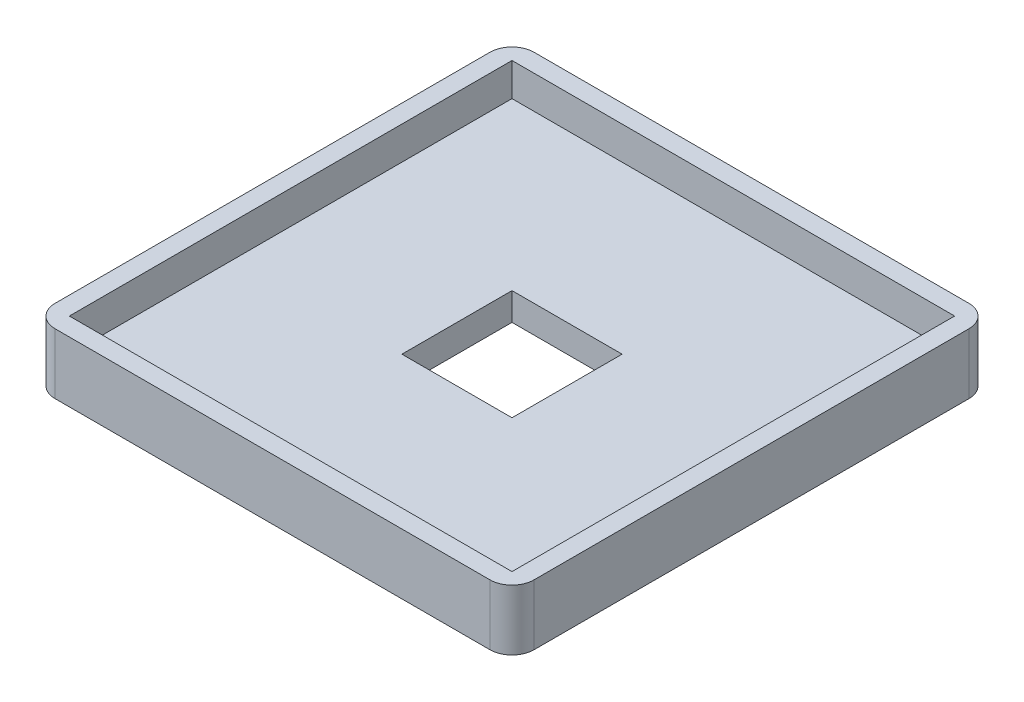
ISO-10303-21;
HEADER;
FILE_DESCRIPTION(('STEP AP214'),'2;1');
FILE_NAME('part.step','',(''),(''),'','','');
FILE_SCHEMA(('AUTOMOTIVE_DESIGN { 1 0 10303 214 1 1 1 1 }'));
ENDSEC;
DATA;
#1=APPLICATION_CONTEXT('core data for automotive mechanical design processes');
#2=APPLICATION_PROTOCOL_DEFINITION('international standard','automotive_design',2000,#1);
#3=PRODUCT_CONTEXT('',#1,'mechanical');
#4=PRODUCT('Part','Part','',(#3));
#5=PRODUCT_RELATED_PRODUCT_CATEGORY('part','',(#4));
#6=PRODUCT_DEFINITION_FORMATION('','',#4);
#7=PRODUCT_DEFINITION_CONTEXT('part definition',#1,'design');
#8=PRODUCT_DEFINITION('design','',#6,#7);
#9=PRODUCT_DEFINITION_SHAPE('','',#8);
#10=(LENGTH_UNIT() NAMED_UNIT(*) SI_UNIT(.MILLI.,.METRE.));
#11=(NAMED_UNIT(*) PLANE_ANGLE_UNIT() SI_UNIT($,.RADIAN.));
#12=(NAMED_UNIT(*) SI_UNIT($,.STERADIAN.) SOLID_ANGLE_UNIT());
#13=UNCERTAINTY_MEASURE_WITH_UNIT(LENGTH_MEASURE(1.E-05),#10,'distance_accuracy_value','');
#14=(GEOMETRIC_REPRESENTATION_CONTEXT(3) GLOBAL_UNCERTAINTY_ASSIGNED_CONTEXT((#13)) GLOBAL_UNIT_ASSIGNED_CONTEXT((#10,
#11,#12)) REPRESENTATION_CONTEXT('',''));
#15=CARTESIAN_POINT('',(0.,0.,0.));
#16=DIRECTION('',(0.,0.,1.));
#17=DIRECTION('',(1.,0.,0.));
#18=AXIS2_PLACEMENT_3D('',#15,#16,#17);
#19=CARTESIAN_POINT('',(21.75,2.5,-21.75));
#20=DIRECTION('',(-1.,0.,0.));
#21=DIRECTION('',(0.,0.,1.));
#22=AXIS2_PLACEMENT_3D('',#19,#20,#21);
#23=PLANE('',#22);
#24=DIRECTION('',(0.,0.,-1.));
#25=VECTOR('',#24,1.);
#26=CARTESIAN_POINT('',(21.75,0.,-21.75));
#27=LINE('',#26,#25);
#28=CARTESIAN_POINT('',(21.75,0.,19.75));
#29=VERTEX_POINT('',#28);
#30=CARTESIAN_POINT('',(21.75,0.,-19.75));
#31=VERTEX_POINT('',#30);
#32=EDGE_CURVE('E226',#29,#31,#27,.T.);
#33=ORIENTED_EDGE('',*,*,#32,.T.);
#34=DIRECTION('',(0.,-1.,0.));
#35=VECTOR('',#34,1.);
#36=CARTESIAN_POINT('',(21.75,2.5,-19.75));
#37=LINE('',#36,#35);
#38=CARTESIAN_POINT('',(21.75,5.5,-19.75));
#39=VERTEX_POINT('',#38);
#40=EDGE_CURVE('E262',#31,#39,#37,.F.);
#41=ORIENTED_EDGE('',*,*,#40,.T.);
#42=DIRECTION('',(0.,0.,-1.));
#43=VECTOR('',#42,1.);
#44=CARTESIAN_POINT('',(21.75,5.5,-21.75));
#45=LINE('',#44,#43);
#46=CARTESIAN_POINT('',(21.75,5.5,19.75));
#47=VERTEX_POINT('',#46);
#48=EDGE_CURVE('E216',#47,#39,#45,.T.);
#49=ORIENTED_EDGE('',*,*,#48,.F.);
#50=DIRECTION('',(0.,-1.,0.));
#51=VECTOR('',#50,1.);
#52=CARTESIAN_POINT('',(21.75,2.5,19.75));
#53=LINE('',#52,#51);
#54=EDGE_CURVE('E259',#47,#29,#53,.T.);
#55=ORIENTED_EDGE('',*,*,#54,.T.);
#56=EDGE_LOOP('',(#33,#41,#49,#55));
#57=FACE_BOUND('',#56,.T.);
#58=ADVANCED_FACE('F39',(#57),#23,.F.);
#59=CARTESIAN_POINT('',(-21.75,2.5,-21.75));
#60=DIRECTION('',(0.,0.,1.));
#61=DIRECTION('',(1.,0.,0.));
#62=AXIS2_PLACEMENT_3D('',#59,#60,#61);
#63=PLANE('',#62);
#64=DIRECTION('',(-1.,0.,0.));
#65=VECTOR('',#64,1.);
#66=CARTESIAN_POINT('',(-21.75,5.5,-21.75));
#67=LINE('',#66,#65);
#68=CARTESIAN_POINT('',(19.75,5.5,-21.75));
#69=VERTEX_POINT('',#68);
#70=CARTESIAN_POINT('',(-19.75,5.5,-21.75));
#71=VERTEX_POINT('',#70);
#72=EDGE_CURVE('E219',#69,#71,#67,.T.);
#73=ORIENTED_EDGE('',*,*,#72,.F.);
#74=DIRECTION('',(0.,-1.,0.));
#75=VECTOR('',#74,1.);
#76=CARTESIAN_POINT('',(19.75,2.5,-21.75));
#77=LINE('',#76,#75);
#78=CARTESIAN_POINT('',(19.75,0.,-21.75));
#79=VERTEX_POINT('',#78);
#80=EDGE_CURVE('E248',#69,#79,#77,.T.);
#81=ORIENTED_EDGE('',*,*,#80,.T.);
#82=DIRECTION('',(-1.,0.,0.));
#83=VECTOR('',#82,1.);
#84=CARTESIAN_POINT('',(-21.75,0.,-21.75));
#85=LINE('',#84,#83);
#86=CARTESIAN_POINT('',(-19.75,0.,-21.75));
#87=VERTEX_POINT('',#86);
#88=EDGE_CURVE('E229',#79,#87,#85,.T.);
#89=ORIENTED_EDGE('',*,*,#88,.T.);
#90=DIRECTION('',(0.,-1.,0.));
#91=VECTOR('',#90,1.);
#92=CARTESIAN_POINT('',(-19.75,2.5,-21.75));
#93=LINE('',#92,#91);
#94=EDGE_CURVE('E246',#87,#71,#93,.F.);
#95=ORIENTED_EDGE('',*,*,#94,.T.);
#96=EDGE_LOOP('',(#73,#81,#89,#95));
#97=FACE_BOUND('',#96,.T.);
#98=ADVANCED_FACE('F307',(#97),#63,.F.);
#99=CARTESIAN_POINT('',(-21.75,2.5,-21.75));
#100=DIRECTION('',(1.,0.,0.));
#101=DIRECTION('',(0.,0.,-1.));
#102=AXIS2_PLACEMENT_3D('',#99,#100,#101);
#103=PLANE('',#102);
#104=DIRECTION('',(0.,0.,1.));
#105=VECTOR('',#104,1.);
#106=CARTESIAN_POINT('',(-21.75,0.,-21.75));
#107=LINE('',#106,#105);
#108=CARTESIAN_POINT('',(-21.75,0.,-19.75));
#109=VERTEX_POINT('',#108);
#110=CARTESIAN_POINT('',(-21.75,0.,19.75));
#111=VERTEX_POINT('',#110);
#112=EDGE_CURVE('E232',#109,#111,#107,.T.);
#113=ORIENTED_EDGE('',*,*,#112,.T.);
#114=DIRECTION('',(0.,-1.,0.));
#115=VECTOR('',#114,1.);
#116=CARTESIAN_POINT('',(-21.75,2.5,19.75));
#117=LINE('',#116,#115);
#118=CARTESIAN_POINT('',(-21.75,5.5,19.75));
#119=VERTEX_POINT('',#118);
#120=EDGE_CURVE('E11',#111,#119,#117,.F.);
#121=ORIENTED_EDGE('',*,*,#120,.T.);
#122=DIRECTION('',(0.,0.,1.));
#123=VECTOR('',#122,1.);
#124=CARTESIAN_POINT('',(-21.75,5.5,-21.75));
#125=LINE('',#124,#123);
#126=CARTESIAN_POINT('',(-21.75,5.5,-19.75));
#127=VERTEX_POINT('',#126);
#128=EDGE_CURVE('E222',#127,#119,#125,.T.);
#129=ORIENTED_EDGE('',*,*,#128,.F.);
#130=DIRECTION('',(0.,-1.,0.));
#131=VECTOR('',#130,1.);
#132=CARTESIAN_POINT('',(-21.75,2.5,-19.75));
#133=LINE('',#132,#131);
#134=EDGE_CURVE('E47',#127,#109,#133,.T.);
#135=ORIENTED_EDGE('',*,*,#134,.T.);
#136=EDGE_LOOP('',(#113,#121,#129,#135));
#137=FACE_BOUND('',#136,.T.);
#138=ADVANCED_FACE('F279',(#137),#103,.F.);
#139=CARTESIAN_POINT('',(-21.75,2.5,21.75));
#140=DIRECTION('',(0.,0.,-1.));
#141=DIRECTION('',(-1.,0.,0.));
#142=AXIS2_PLACEMENT_3D('',#139,#140,#141);
#143=PLANE('',#142);
#144=DIRECTION('',(1.,0.,0.));
#145=VECTOR('',#144,1.);
#146=CARTESIAN_POINT('',(-21.75,0.,21.75));
#147=LINE('',#146,#145);
#148=CARTESIAN_POINT('',(-19.75,0.,21.75));
#149=VERTEX_POINT('',#148);
#150=CARTESIAN_POINT('',(19.75,0.,21.75));
#151=VERTEX_POINT('',#150);
#152=EDGE_CURVE('E235',#149,#151,#147,.T.);
#153=ORIENTED_EDGE('',*,*,#152,.T.);
#154=DIRECTION('',(0.,-1.,0.));
#155=VECTOR('',#154,1.);
#156=CARTESIAN_POINT('',(19.75,2.5,21.75));
#157=LINE('',#156,#155);
#158=CARTESIAN_POINT('',(19.75,5.5,21.75));
#159=VERTEX_POINT('',#158);
#160=EDGE_CURVE('E54',#151,#159,#157,.F.);
#161=ORIENTED_EDGE('',*,*,#160,.T.);
#162=DIRECTION('',(1.,0.,0.));
#163=VECTOR('',#162,1.);
#164=CARTESIAN_POINT('',(-21.75,5.5,21.75));
#165=LINE('',#164,#163);
#166=CARTESIAN_POINT('',(-19.75,5.5,21.75));
#167=VERTEX_POINT('',#166);
#168=EDGE_CURVE('E224',#167,#159,#165,.T.);
#169=ORIENTED_EDGE('',*,*,#168,.F.);
#170=DIRECTION('',(0.,-1.,0.));
#171=VECTOR('',#170,1.);
#172=CARTESIAN_POINT('',(-19.75,2.5,21.75));
#173=LINE('',#172,#171);
#174=EDGE_CURVE('E271',#167,#149,#173,.T.);
#175=ORIENTED_EDGE('',*,*,#174,.T.);
#176=EDGE_LOOP('',(#153,#161,#169,#175));
#177=FACE_BOUND('',#176,.T.);
#178=ADVANCED_FACE('F290',(#177),#143,.F.);
#179=CARTESIAN_POINT('',(0.,0.,0.));
#180=DIRECTION('',(0.,1.,0.));
#181=DIRECTION('',(0.,0.,1.));
#182=AXIS2_PLACEMENT_3D('',#179,#180,#181);
#183=PLANE('',#182);
#184=DIRECTION('',(1.,0.,0.));
#185=VECTOR('',#184,1.);
#186=CARTESIAN_POINT('',(0.,0.,5.));
#187=LINE('',#186,#185);
#188=CARTESIAN_POINT('',(-5.,0.,5.));
#189=VERTEX_POINT('',#188);
#190=CARTESIAN_POINT('',(5.,0.,5.));
#191=VERTEX_POINT('',#190);
#192=EDGE_CURVE('E241',#189,#191,#187,.T.);
#193=ORIENTED_EDGE('',*,*,#192,.T.);
#194=DIRECTION('',(0.,0.,-1.));
#195=VECTOR('',#194,1.);
#196=CARTESIAN_POINT('',(5.,0.,0.));
#197=LINE('',#196,#195);
#198=CARTESIAN_POINT('',(5.,0.,-5.));
#199=VERTEX_POINT('',#198);
#200=EDGE_CURVE('E244',#191,#199,#197,.T.);
#201=ORIENTED_EDGE('',*,*,#200,.T.);
#202=DIRECTION('',(-1.,0.,0.));
#203=VECTOR('',#202,1.);
#204=CARTESIAN_POINT('',(0.,0.,-5.));
#205=LINE('',#204,#203);
#206=CARTESIAN_POINT('',(-5.,0.,-5.));
#207=VERTEX_POINT('',#206);
#208=EDGE_CURVE('E160',#199,#207,#205,.T.);
#209=ORIENTED_EDGE('',*,*,#208,.T.);
#210=DIRECTION('',(0.,0.,1.));
#211=VECTOR('',#210,1.);
#212=CARTESIAN_POINT('',(-5.,0.,0.));
#213=LINE('',#212,#211);
#214=EDGE_CURVE('E238',#207,#189,#213,.T.);
#215=ORIENTED_EDGE('',*,*,#214,.T.);
#216=EDGE_LOOP('',(#193,#201,#209,#215));
#217=FACE_BOUND('',#216,.T.);
#218=ORIENTED_EDGE('',*,*,#88,.F.);
#219=CARTESIAN_POINT('',(19.75,0.,-19.75));
#220=DIRECTION('',(0.,1.,0.));
#221=DIRECTION('',(0.,0.,1.));
#222=AXIS2_PLACEMENT_3D('',#219,#220,#221);
#223=CIRCLE('',#222,2.);
#224=EDGE_CURVE('E257',#79,#31,#223,.F.);
#225=ORIENTED_EDGE('',*,*,#224,.T.);
#226=ORIENTED_EDGE('',*,*,#32,.F.);
#227=CARTESIAN_POINT('',(19.75,0.,19.75));
#228=DIRECTION('',(0.,1.,0.));
#229=DIRECTION('',(0.,0.,1.));
#230=AXIS2_PLACEMENT_3D('',#227,#228,#229);
#231=CIRCLE('',#230,2.);
#232=EDGE_CURVE('E255',#29,#151,#231,.F.);
#233=ORIENTED_EDGE('',*,*,#232,.T.);
#234=ORIENTED_EDGE('',*,*,#152,.F.);
#235=CARTESIAN_POINT('',(-19.75,0.,19.75));
#236=DIRECTION('',(0.,1.,0.));
#237=DIRECTION('',(0.,0.,1.));
#238=AXIS2_PLACEMENT_3D('',#235,#236,#237);
#239=CIRCLE('',#238,2.);
#240=EDGE_CURVE('E253',#149,#111,#239,.F.);
#241=ORIENTED_EDGE('',*,*,#240,.T.);
#242=ORIENTED_EDGE('',*,*,#112,.F.);
#243=CARTESIAN_POINT('',(-19.75,0.,-19.75));
#244=DIRECTION('',(0.,1.,0.));
#245=DIRECTION('',(0.,0.,1.));
#246=AXIS2_PLACEMENT_3D('',#243,#244,#245);
#247=CIRCLE('',#246,2.);
#248=EDGE_CURVE('E251',#109,#87,#247,.F.);
#249=ORIENTED_EDGE('',*,*,#248,.T.);
#250=EDGE_LOOP('',(#218,#225,#226,#233,#234,#241,#242,#249));
#251=FACE_BOUND('',#250,.T.);
#252=ADVANCED_FACE('F285',(#217,#251),#183,.F.);
#253=CARTESIAN_POINT('',(0.,5.5,0.));
#254=DIRECTION('',(0.,1.,0.));
#255=DIRECTION('',(0.,0.,1.));
#256=AXIS2_PLACEMENT_3D('',#253,#254,#255);
#257=PLANE('',#256);
#258=ORIENTED_EDGE('',*,*,#48,.T.);
#259=CARTESIAN_POINT('',(19.75,5.5,-19.75));
#260=DIRECTION('',(0.,1.,0.));
#261=DIRECTION('',(0.,0.,1.));
#262=AXIS2_PLACEMENT_3D('',#259,#260,#261);
#263=CIRCLE('',#262,2.);
#264=EDGE_CURVE('E269',#39,#69,#263,.T.);
#265=ORIENTED_EDGE('',*,*,#264,.T.);
#266=ORIENTED_EDGE('',*,*,#72,.T.);
#267=CARTESIAN_POINT('',(-19.75,5.5,-19.75));
#268=DIRECTION('',(0.,1.,0.));
#269=DIRECTION('',(0.,0.,1.));
#270=AXIS2_PLACEMENT_3D('',#267,#268,#269);
#271=CIRCLE('',#270,2.);
#272=EDGE_CURVE('E264',#71,#127,#271,.T.);
#273=ORIENTED_EDGE('',*,*,#272,.T.);
#274=ORIENTED_EDGE('',*,*,#128,.T.);
#275=CARTESIAN_POINT('',(-19.75,5.5,19.75));
#276=DIRECTION('',(0.,1.,0.));
#277=DIRECTION('',(0.,0.,1.));
#278=AXIS2_PLACEMENT_3D('',#275,#276,#277);
#279=CIRCLE('',#278,2.);
#280=EDGE_CURVE('E61',#119,#167,#279,.T.);
#281=ORIENTED_EDGE('',*,*,#280,.T.);
#282=ORIENTED_EDGE('',*,*,#168,.T.);
#283=CARTESIAN_POINT('',(19.75,5.5,19.75));
#284=DIRECTION('',(0.,1.,0.));
#285=DIRECTION('',(0.,0.,1.));
#286=AXIS2_PLACEMENT_3D('',#283,#284,#285);
#287=CIRCLE('',#286,2.);
#288=EDGE_CURVE('E267',#159,#47,#287,.T.);
#289=ORIENTED_EDGE('',*,*,#288,.T.);
#290=EDGE_LOOP('',(#258,#265,#266,#273,#274,#281,#282,#289));
#291=FACE_BOUND('',#290,.T.);
#292=DIRECTION('',(-1.,0.,0.));
#293=VECTOR('',#292,1.);
#294=CARTESIAN_POINT('',(-20.1,5.5,-20.1));
#295=LINE('',#294,#293);
#296=CARTESIAN_POINT('',(20.1,5.5,-20.1));
#297=VERTEX_POINT('',#296);
#298=CARTESIAN_POINT('',(-20.1,5.5,-20.1));
#299=VERTEX_POINT('',#298);
#300=EDGE_CURVE('E190',#297,#299,#295,.T.);
#301=ORIENTED_EDGE('',*,*,#300,.F.);
#302=DIRECTION('',(0.,0.,-1.));
#303=VECTOR('',#302,1.);
#304=CARTESIAN_POINT('',(20.1,5.5,-20.1));
#305=LINE('',#304,#303);
#306=CARTESIAN_POINT('',(20.1,5.5,20.1));
#307=VERTEX_POINT('',#306);
#308=EDGE_CURVE('E188',#307,#297,#305,.T.);
#309=ORIENTED_EDGE('',*,*,#308,.F.);
#310=DIRECTION('',(1.,0.,0.));
#311=VECTOR('',#310,1.);
#312=CARTESIAN_POINT('',(-20.1,5.5,20.1));
#313=LINE('',#312,#311);
#314=CARTESIAN_POINT('',(-20.1,5.5,20.1));
#315=VERTEX_POINT('',#314);
#316=EDGE_CURVE('E196',#315,#307,#313,.T.);
#317=ORIENTED_EDGE('',*,*,#316,.F.);
#318=DIRECTION('',(0.,0.,1.));
#319=VECTOR('',#318,1.);
#320=CARTESIAN_POINT('',(-20.1,5.5,-20.1));
#321=LINE('',#320,#319);
#322=EDGE_CURVE('E193',#299,#315,#321,.T.);
#323=ORIENTED_EDGE('',*,*,#322,.F.);
#324=EDGE_LOOP('',(#301,#309,#317,#323));
#325=FACE_BOUND('',#324,.T.);
#326=ADVANCED_FACE('F292',(#291,#325),#257,.T.);
#327=CARTESIAN_POINT('',(20.1,5.5,-20.1));
#328=DIRECTION('',(-1.,0.,0.));
#329=DIRECTION('',(0.,0.,1.));
#330=AXIS2_PLACEMENT_3D('',#327,#328,#329);
#331=PLANE('',#330);
#332=DIRECTION('',(0.,0.,-1.));
#333=VECTOR('',#332,1.);
#334=CARTESIAN_POINT('',(20.1,2.5,-20.1));
#335=LINE('',#334,#333);
#336=CARTESIAN_POINT('',(20.1,2.5,20.1));
#337=VERTEX_POINT('',#336);
#338=CARTESIAN_POINT('',(20.1,2.5,-20.1));
#339=VERTEX_POINT('',#338);
#340=EDGE_CURVE('E183',#337,#339,#335,.T.);
#341=ORIENTED_EDGE('',*,*,#340,.F.);
#342=DIRECTION('',(0.,-1.,0.));
#343=VECTOR('',#342,1.);
#344=CARTESIAN_POINT('',(20.1,5.5,20.1));
#345=LINE('',#344,#343);
#346=EDGE_CURVE('E198',#307,#337,#345,.T.);
#347=ORIENTED_EDGE('',*,*,#346,.F.);
#348=ORIENTED_EDGE('',*,*,#308,.T.);
#349=DIRECTION('',(0.,-1.,0.));
#350=VECTOR('',#349,1.);
#351=CARTESIAN_POINT('',(20.1,5.5,-20.1));
#352=LINE('',#351,#350);
#353=EDGE_CURVE('E213',#297,#339,#352,.T.);
#354=ORIENTED_EDGE('',*,*,#353,.T.);
#355=EDGE_LOOP('',(#341,#347,#348,#354));
#356=FACE_BOUND('',#355,.T.);
#357=ADVANCED_FACE('F344',(#356),#331,.T.);
#358=CARTESIAN_POINT('',(-20.1,5.5,-20.1));
#359=DIRECTION('',(0.,0.,1.));
#360=DIRECTION('',(1.,0.,0.));
#361=AXIS2_PLACEMENT_3D('',#358,#359,#360);
#362=PLANE('',#361);
#363=DIRECTION('',(-1.,0.,0.));
#364=VECTOR('',#363,1.);
#365=CARTESIAN_POINT('',(-20.1,2.5,-20.1));
#366=LINE('',#365,#364);
#367=CARTESIAN_POINT('',(-20.1,2.5,-20.1));
#368=VERTEX_POINT('',#367);
#369=EDGE_CURVE('E200',#339,#368,#366,.T.);
#370=ORIENTED_EDGE('',*,*,#369,.F.);
#371=ORIENTED_EDGE('',*,*,#353,.F.);
#372=ORIENTED_EDGE('',*,*,#300,.T.);
#373=DIRECTION('',(0.,-1.,0.));
#374=VECTOR('',#373,1.);
#375=CARTESIAN_POINT('',(-20.1,5.5,-20.1));
#376=LINE('',#375,#374);
#377=EDGE_CURVE('E210',#299,#368,#376,.T.);
#378=ORIENTED_EDGE('',*,*,#377,.T.);
#379=EDGE_LOOP('',(#370,#371,#372,#378));
#380=FACE_BOUND('',#379,.T.);
#381=ADVANCED_FACE('F426',(#380),#362,.T.);
#382=CARTESIAN_POINT('',(-20.1,5.5,-20.1));
#383=DIRECTION('',(1.,0.,0.));
#384=DIRECTION('',(0.,0.,-1.));
#385=AXIS2_PLACEMENT_3D('',#382,#383,#384);
#386=PLANE('',#385);
#387=DIRECTION('',(0.,0.,1.));
#388=VECTOR('',#387,1.);
#389=CARTESIAN_POINT('',(-20.1,2.5,-20.1));
#390=LINE('',#389,#388);
#391=CARTESIAN_POINT('',(-20.1,2.5,20.1));
#392=VERTEX_POINT('',#391);
#393=EDGE_CURVE('E202',#368,#392,#390,.T.);
#394=ORIENTED_EDGE('',*,*,#393,.F.);
#395=ORIENTED_EDGE('',*,*,#377,.F.);
#396=ORIENTED_EDGE('',*,*,#322,.T.);
#397=DIRECTION('',(0.,-1.,0.));
#398=VECTOR('',#397,1.);
#399=CARTESIAN_POINT('',(-20.1,5.5,20.1));
#400=LINE('',#399,#398);
#401=EDGE_CURVE('E207',#315,#392,#400,.T.);
#402=ORIENTED_EDGE('',*,*,#401,.T.);
#403=EDGE_LOOP('',(#394,#395,#396,#402));
#404=FACE_BOUND('',#403,.T.);
#405=ADVANCED_FACE('F423',(#404),#386,.T.);
#406=CARTESIAN_POINT('',(-20.1,5.5,20.1));
#407=DIRECTION('',(0.,0.,-1.));
#408=DIRECTION('',(-1.,0.,0.));
#409=AXIS2_PLACEMENT_3D('',#406,#407,#408);
#410=PLANE('',#409);
#411=DIRECTION('',(1.,0.,0.));
#412=VECTOR('',#411,1.);
#413=CARTESIAN_POINT('',(-20.1,2.5,20.1));
#414=LINE('',#413,#412);
#415=EDGE_CURVE('E191',#392,#337,#414,.T.);
#416=ORIENTED_EDGE('',*,*,#415,.F.);
#417=ORIENTED_EDGE('',*,*,#401,.F.);
#418=ORIENTED_EDGE('',*,*,#316,.T.);
#419=ORIENTED_EDGE('',*,*,#346,.T.);
#420=EDGE_LOOP('',(#416,#417,#418,#419));
#421=FACE_BOUND('',#420,.T.);
#422=ADVANCED_FACE('F388',(#421),#410,.T.);
#423=CARTESIAN_POINT('',(0.,2.5,0.));
#424=DIRECTION('',(0.,1.,0.));
#425=DIRECTION('',(0.,0.,1.));
#426=AXIS2_PLACEMENT_3D('',#423,#424,#425);
#427=PLANE('',#426);
#428=DIRECTION('',(0.,0.,-1.));
#429=VECTOR('',#428,1.);
#430=CARTESIAN_POINT('',(5.,2.5,-5.));
#431=LINE('',#430,#429);
#432=CARTESIAN_POINT('',(5.,2.5,5.));
#433=VERTEX_POINT('',#432);
#434=CARTESIAN_POINT('',(5.,2.5,-5.));
#435=VERTEX_POINT('',#434);
#436=EDGE_CURVE('E167',#433,#435,#431,.T.);
#437=ORIENTED_EDGE('',*,*,#436,.F.);
#438=DIRECTION('',(1.,0.,0.));
#439=VECTOR('',#438,1.);
#440=CARTESIAN_POINT('',(-5.,2.5,5.));
#441=LINE('',#440,#439);
#442=CARTESIAN_POINT('',(-5.,2.5,5.));
#443=VERTEX_POINT('',#442);
#444=EDGE_CURVE('E164',#443,#433,#441,.T.);
#445=ORIENTED_EDGE('',*,*,#444,.F.);
#446=DIRECTION('',(0.,0.,1.));
#447=VECTOR('',#446,1.);
#448=CARTESIAN_POINT('',(-5.,2.5,-5.));
#449=LINE('',#448,#447);
#450=CARTESIAN_POINT('',(-5.,2.5,-5.));
#451=VERTEX_POINT('',#450);
#452=EDGE_CURVE('E177',#451,#443,#449,.T.);
#453=ORIENTED_EDGE('',*,*,#452,.F.);
#454=DIRECTION('',(-1.,0.,0.));
#455=VECTOR('',#454,1.);
#456=CARTESIAN_POINT('',(-5.,2.5,-5.));
#457=LINE('',#456,#455);
#458=EDGE_CURVE('E157',#435,#451,#457,.T.);
#459=ORIENTED_EDGE('',*,*,#458,.F.);
#460=EDGE_LOOP('',(#437,#445,#453,#459));
#461=FACE_BOUND('',#460,.T.);
#462=ORIENTED_EDGE('',*,*,#340,.T.);
#463=ORIENTED_EDGE('',*,*,#369,.T.);
#464=ORIENTED_EDGE('',*,*,#393,.T.);
#465=ORIENTED_EDGE('',*,*,#415,.T.);
#466=EDGE_LOOP('',(#462,#463,#464,#465));
#467=FACE_BOUND('',#466,.T.);
#468=ADVANCED_FACE('F175',(#461,#467),#427,.T.);
#469=CARTESIAN_POINT('',(5.,-2.5,-5.));
#470=DIRECTION('',(1.,0.,0.));
#471=DIRECTION('',(0.,0.,-1.));
#472=AXIS2_PLACEMENT_3D('',#469,#470,#471);
#473=PLANE('',#472);
#474=DIRECTION('',(0.,1.,0.));
#475=VECTOR('',#474,1.);
#476=CARTESIAN_POINT('',(5.,-2.5,5.));
#477=LINE('',#476,#475);
#478=EDGE_CURVE('E170',#191,#433,#477,.T.);
#479=ORIENTED_EDGE('',*,*,#478,.T.);
#480=ORIENTED_EDGE('',*,*,#436,.T.);
#481=DIRECTION('',(0.,1.,0.));
#482=VECTOR('',#481,1.);
#483=CARTESIAN_POINT('',(5.,-2.5,-5.));
#484=LINE('',#483,#482);
#485=EDGE_CURVE('E153',#199,#435,#484,.T.);
#486=ORIENTED_EDGE('',*,*,#485,.F.);
#487=ORIENTED_EDGE('',*,*,#200,.F.);
#488=EDGE_LOOP('',(#479,#480,#486,#487));
#489=FACE_BOUND('',#488,.T.);
#490=ADVANCED_FACE('F168',(#489),#473,.F.);
#491=CARTESIAN_POINT('',(-5.,-2.5,5.));
#492=DIRECTION('',(0.,0.,1.));
#493=DIRECTION('',(1.,0.,0.));
#494=AXIS2_PLACEMENT_3D('',#491,#492,#493);
#495=PLANE('',#494);
#496=DIRECTION('',(0.,1.,0.));
#497=VECTOR('',#496,1.);
#498=CARTESIAN_POINT('',(-5.,-2.5,5.));
#499=LINE('',#498,#497);
#500=EDGE_CURVE('E184',#189,#443,#499,.T.);
#501=ORIENTED_EDGE('',*,*,#500,.T.);
#502=ORIENTED_EDGE('',*,*,#444,.T.);
#503=ORIENTED_EDGE('',*,*,#478,.F.);
#504=ORIENTED_EDGE('',*,*,#192,.F.);
#505=EDGE_LOOP('',(#501,#502,#503,#504));
#506=FACE_BOUND('',#505,.T.);
#507=ADVANCED_FACE('F399',(#506),#495,.F.);
#508=CARTESIAN_POINT('',(-5.,-2.5,-5.));
#509=DIRECTION('',(-1.,0.,0.));
#510=DIRECTION('',(0.,0.,1.));
#511=AXIS2_PLACEMENT_3D('',#508,#509,#510);
#512=PLANE('',#511);
#513=DIRECTION('',(0.,1.,0.));
#514=VECTOR('',#513,1.);
#515=CARTESIAN_POINT('',(-5.,-2.5,-5.));
#516=LINE('',#515,#514);
#517=EDGE_CURVE('E163',#207,#451,#516,.T.);
#518=ORIENTED_EDGE('',*,*,#517,.T.);
#519=ORIENTED_EDGE('',*,*,#452,.T.);
#520=ORIENTED_EDGE('',*,*,#500,.F.);
#521=ORIENTED_EDGE('',*,*,#214,.F.);
#522=EDGE_LOOP('',(#518,#519,#520,#521));
#523=FACE_BOUND('',#522,.T.);
#524=ADVANCED_FACE('F406',(#523),#512,.F.);
#525=CARTESIAN_POINT('',(-5.,-2.5,-5.));
#526=DIRECTION('',(0.,0.,-1.));
#527=DIRECTION('',(-1.,0.,0.));
#528=AXIS2_PLACEMENT_3D('',#525,#526,#527);
#529=PLANE('',#528);
#530=ORIENTED_EDGE('',*,*,#485,.T.);
#531=ORIENTED_EDGE('',*,*,#458,.T.);
#532=ORIENTED_EDGE('',*,*,#517,.F.);
#533=ORIENTED_EDGE('',*,*,#208,.F.);
#534=EDGE_LOOP('',(#530,#531,#532,#533));
#535=FACE_BOUND('',#534,.T.);
#536=ADVANCED_FACE('F155',(#535),#529,.F.);
#537=CARTESIAN_POINT('',(19.75,2.5,-19.75));
#538=DIRECTION('',(0.,-1.,0.));
#539=DIRECTION('',(0.,0.,-1.));
#540=AXIS2_PLACEMENT_3D('',#537,#538,#539);
#541=CYLINDRICAL_SURFACE('',#540,2.);
#542=ORIENTED_EDGE('',*,*,#264,.F.);
#543=ORIENTED_EDGE('',*,*,#40,.F.);
#544=ORIENTED_EDGE('',*,*,#224,.F.);
#545=ORIENTED_EDGE('',*,*,#80,.F.);
#546=EDGE_LOOP('',(#542,#543,#544,#545));
#547=FACE_BOUND('',#546,.T.);
#548=ADVANCED_FACE('F304',(#547),#541,.T.);
#549=CARTESIAN_POINT('',(19.75,2.5,19.75));
#550=DIRECTION('',(0.,-1.,0.));
#551=DIRECTION('',(0.,0.,-1.));
#552=AXIS2_PLACEMENT_3D('',#549,#550,#551);
#553=CYLINDRICAL_SURFACE('',#552,2.);
#554=ORIENTED_EDGE('',*,*,#288,.F.);
#555=ORIENTED_EDGE('',*,*,#160,.F.);
#556=ORIENTED_EDGE('',*,*,#232,.F.);
#557=ORIENTED_EDGE('',*,*,#54,.F.);
#558=EDGE_LOOP('',(#554,#555,#556,#557));
#559=FACE_BOUND('',#558,.T.);
#560=ADVANCED_FACE('F297',(#559),#553,.T.);
#561=CARTESIAN_POINT('',(-19.75,2.5,19.75));
#562=DIRECTION('',(0.,-1.,0.));
#563=DIRECTION('',(0.,0.,-1.));
#564=AXIS2_PLACEMENT_3D('',#561,#562,#563);
#565=CYLINDRICAL_SURFACE('',#564,2.);
#566=ORIENTED_EDGE('',*,*,#280,.F.);
#567=ORIENTED_EDGE('',*,*,#120,.F.);
#568=ORIENTED_EDGE('',*,*,#240,.F.);
#569=ORIENTED_EDGE('',*,*,#174,.F.);
#570=EDGE_LOOP('',(#566,#567,#568,#569));
#571=FACE_BOUND('',#570,.T.);
#572=ADVANCED_FACE('F289',(#571),#565,.T.);
#573=CARTESIAN_POINT('',(-19.75,2.5,-19.75));
#574=DIRECTION('',(0.,-1.,0.));
#575=DIRECTION('',(0.,0.,-1.));
#576=AXIS2_PLACEMENT_3D('',#573,#574,#575);
#577=CYLINDRICAL_SURFACE('',#576,2.);
#578=ORIENTED_EDGE('',*,*,#272,.F.);
#579=ORIENTED_EDGE('',*,*,#94,.F.);
#580=ORIENTED_EDGE('',*,*,#248,.F.);
#581=ORIENTED_EDGE('',*,*,#134,.F.);
#582=EDGE_LOOP('',(#578,#579,#580,#581));
#583=FACE_BOUND('',#582,.T.);
#584=ADVANCED_FACE('F41',(#583),#577,.T.);
#585=CLOSED_SHELL('',(#58,#98,#138,#178,#252,#326,#357,#381,#405,#422,#468,#490,#507,#524,#536,
#548,#560,#572,#584));
#586=MANIFOLD_SOLID_BREP('B2',#585);
#587=ADVANCED_BREP_SHAPE_REPRESENTATION('',(#18,#586),#14);
#588=SHAPE_DEFINITION_REPRESENTATION(#9,#587);
ENDSEC;
END-ISO-10303-21;
